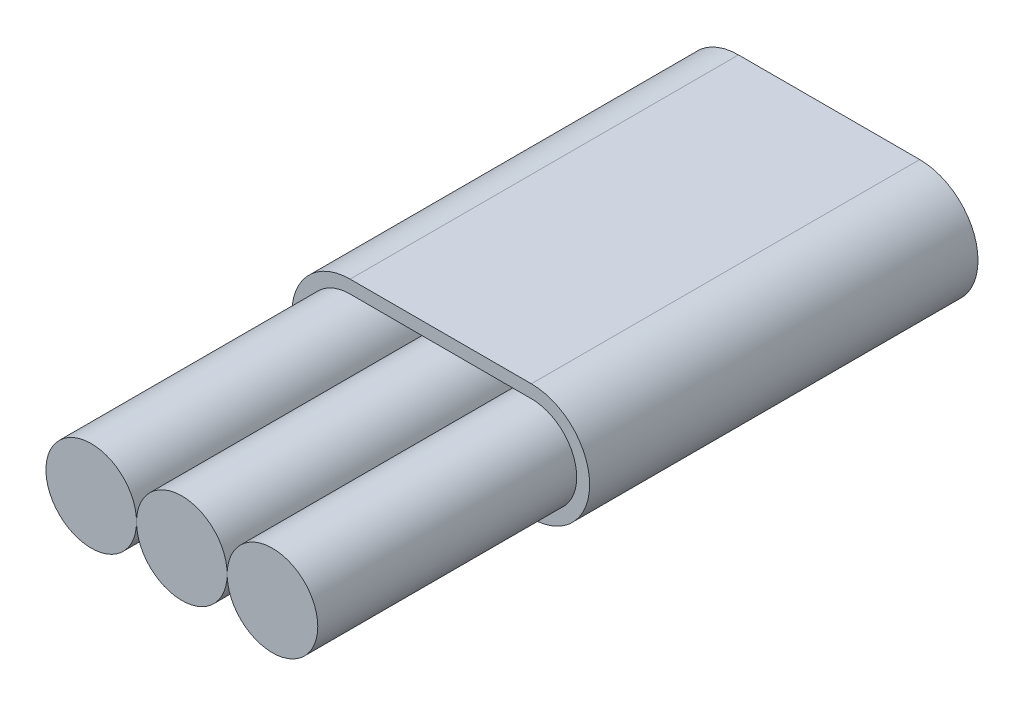
ISO-10303-21;
HEADER;
FILE_DESCRIPTION(('STEP AP214'),'2;1');
FILE_NAME('part.step','',(''),(''),'','','');
FILE_SCHEMA(('AUTOMOTIVE_DESIGN { 1 0 10303 214 1 1 1 1 }'));
ENDSEC;
DATA;
#1=APPLICATION_CONTEXT('core data for automotive mechanical design processes');
#2=APPLICATION_PROTOCOL_DEFINITION('international standard','automotive_design',2000,#1);
#3=PRODUCT_CONTEXT('',#1,'mechanical');
#4=PRODUCT('Part','Part','',(#3));
#5=PRODUCT_RELATED_PRODUCT_CATEGORY('part','',(#4));
#6=PRODUCT_DEFINITION_FORMATION('','',#4);
#7=PRODUCT_DEFINITION_CONTEXT('part definition',#1,'design');
#8=PRODUCT_DEFINITION('design','',#6,#7);
#9=PRODUCT_DEFINITION_SHAPE('','',#8);
#10=(LENGTH_UNIT() NAMED_UNIT(*) SI_UNIT(.MILLI.,.METRE.));
#11=(NAMED_UNIT(*) PLANE_ANGLE_UNIT() SI_UNIT($,.RADIAN.));
#12=(NAMED_UNIT(*) SI_UNIT($,.STERADIAN.) SOLID_ANGLE_UNIT());
#13=UNCERTAINTY_MEASURE_WITH_UNIT(LENGTH_MEASURE(1.E-05),#10,'distance_accuracy_value','');
#14=(GEOMETRIC_REPRESENTATION_CONTEXT(3) GLOBAL_UNCERTAINTY_ASSIGNED_CONTEXT((#13)) GLOBAL_UNIT_ASSIGNED_CONTEXT((#10,
#11,#12)) REPRESENTATION_CONTEXT('',''));
#15=CARTESIAN_POINT('',(0.,0.,0.));
#16=DIRECTION('',(0.,0.,1.));
#17=DIRECTION('',(1.,0.,0.));
#18=AXIS2_PLACEMENT_3D('',#15,#16,#17);
#19=CARTESIAN_POINT('',(-3.5,0.,15.));
#20=DIRECTION('',(0.,0.,1.));
#21=DIRECTION('',(1.,0.,0.));
#22=AXIS2_PLACEMENT_3D('',#19,#20,#21);
#23=PLANE('',#22);
#24=CARTESIAN_POINT('',(-3.5,0.,15.));
#25=DIRECTION('',(0.,0.,1.));
#26=DIRECTION('',(1.,0.,0.));
#27=AXIS2_PLACEMENT_3D('',#24,#25,#26);
#28=CIRCLE('',#27,2.25);
#29=CARTESIAN_POINT('',(-3.5,2.25,15.));
#30=VERTEX_POINT('',#29);
#31=CARTESIAN_POINT('',(-3.5,-2.25,15.));
#32=VERTEX_POINT('',#31);
#33=EDGE_CURVE('E181',#30,#32,#28,.T.);
#34=ORIENTED_EDGE('',*,*,#33,.T.);
#35=DIRECTION('',(1.,0.,0.));
#36=VECTOR('',#35,1.);
#37=CARTESIAN_POINT('',(-3.5,-2.25,15.));
#38=LINE('',#37,#36);
#39=CARTESIAN_POINT('',(3.5,-2.25,15.));
#40=VERTEX_POINT('',#39);
#41=EDGE_CURVE('E184',#32,#40,#38,.T.);
#42=ORIENTED_EDGE('',*,*,#41,.T.);
#43=CARTESIAN_POINT('',(3.5,0.,15.));
#44=DIRECTION('',(0.,0.,1.));
#45=DIRECTION('',(1.,0.,0.));
#46=AXIS2_PLACEMENT_3D('',#43,#44,#45);
#47=CIRCLE('',#46,2.25);
#48=CARTESIAN_POINT('',(3.5,2.25,15.));
#49=VERTEX_POINT('',#48);
#50=EDGE_CURVE('E187',#40,#49,#47,.T.);
#51=ORIENTED_EDGE('',*,*,#50,.T.);
#52=DIRECTION('',(-1.,0.,0.));
#53=VECTOR('',#52,1.);
#54=CARTESIAN_POINT('',(-3.5,2.25,15.));
#55=LINE('',#54,#53);
#56=EDGE_CURVE('E189',#49,#30,#55,.T.);
#57=ORIENTED_EDGE('',*,*,#56,.T.);
#58=EDGE_LOOP('',(#34,#42,#51,#57));
#59=FACE_BOUND('',#58,.T.);
#60=DIRECTION('',(1.,0.,0.));
#61=VECTOR('',#60,1.);
#62=CARTESIAN_POINT('',(-3.5,-1.75,15.));
#63=LINE('',#62,#61);
#64=CARTESIAN_POINT('',(-3.5,-1.75,15.));
#65=VERTEX_POINT('',#64);
#66=CARTESIAN_POINT('',(3.5,-1.75,15.));
#67=VERTEX_POINT('',#66);
#68=EDGE_CURVE('E153',#65,#67,#63,.T.);
#69=ORIENTED_EDGE('',*,*,#68,.F.);
#70=CARTESIAN_POINT('',(-3.5,0.,15.));
#71=DIRECTION('',(0.,0.,1.));
#72=DIRECTION('',(1.,0.,0.));
#73=AXIS2_PLACEMENT_3D('',#70,#71,#72);
#74=CIRCLE('',#73,1.75);
#75=CARTESIAN_POINT('',(-3.5,1.75,15.));
#76=VERTEX_POINT('',#75);
#77=EDGE_CURVE('E145',#76,#65,#74,.T.);
#78=ORIENTED_EDGE('',*,*,#77,.F.);
#79=DIRECTION('',(-1.,0.,0.));
#80=VECTOR('',#79,1.);
#81=CARTESIAN_POINT('',(-3.5,1.75,15.));
#82=LINE('',#81,#80);
#83=CARTESIAN_POINT('',(3.5,1.75,15.));
#84=VERTEX_POINT('',#83);
#85=EDGE_CURVE('E167',#84,#76,#82,.T.);
#86=ORIENTED_EDGE('',*,*,#85,.F.);
#87=CARTESIAN_POINT('',(3.5,0.,15.));
#88=DIRECTION('',(0.,0.,1.));
#89=DIRECTION('',(1.,0.,0.));
#90=AXIS2_PLACEMENT_3D('',#87,#88,#89);
#91=CIRCLE('',#90,1.75);
#92=EDGE_CURVE('E165',#67,#84,#91,.T.);
#93=ORIENTED_EDGE('',*,*,#92,.F.);
#94=EDGE_LOOP('',(#69,#78,#86,#93));
#95=FACE_BOUND('',#94,.T.);
#96=ADVANCED_FACE('F80',(#59,#95),#23,.T.);
#97=CARTESIAN_POINT('',(-3.5,0.,0.));
#98=DIRECTION('',(0.,0.,1.));
#99=DIRECTION('',(1.,0.,0.));
#100=AXIS2_PLACEMENT_3D('',#97,#98,#99);
#101=PLANE('',#100);
#102=CARTESIAN_POINT('',(-3.5,0.,0.));
#103=DIRECTION('',(0.,0.,1.));
#104=DIRECTION('',(1.,0.,0.));
#105=AXIS2_PLACEMENT_3D('',#102,#103,#104);
#106=CIRCLE('',#105,2.25);
#107=CARTESIAN_POINT('',(-3.5,2.25,0.));
#108=VERTEX_POINT('',#107);
#109=CARTESIAN_POINT('',(-3.5,-2.25,0.));
#110=VERTEX_POINT('',#109);
#111=EDGE_CURVE('E161',#108,#110,#106,.T.);
#112=ORIENTED_EDGE('',*,*,#111,.F.);
#113=DIRECTION('',(-1.,0.,0.));
#114=VECTOR('',#113,1.);
#115=CARTESIAN_POINT('',(-3.5,2.25,0.));
#116=LINE('',#115,#114);
#117=CARTESIAN_POINT('',(3.5,2.25,0.));
#118=VERTEX_POINT('',#117);
#119=EDGE_CURVE('E185',#118,#108,#116,.T.);
#120=ORIENTED_EDGE('',*,*,#119,.F.);
#121=CARTESIAN_POINT('',(3.5,0.,0.));
#122=DIRECTION('',(0.,0.,1.));
#123=DIRECTION('',(1.,0.,0.));
#124=AXIS2_PLACEMENT_3D('',#121,#122,#123);
#125=CIRCLE('',#124,2.25);
#126=CARTESIAN_POINT('',(3.5,-2.25,0.));
#127=VERTEX_POINT('',#126);
#128=EDGE_CURVE('E196',#127,#118,#125,.T.);
#129=ORIENTED_EDGE('',*,*,#128,.F.);
#130=DIRECTION('',(1.,0.,0.));
#131=VECTOR('',#130,1.);
#132=CARTESIAN_POINT('',(-3.5,-2.25,0.));
#133=LINE('',#132,#131);
#134=EDGE_CURVE('E194',#110,#127,#133,.T.);
#135=ORIENTED_EDGE('',*,*,#134,.F.);
#136=EDGE_LOOP('',(#112,#120,#129,#135));
#137=FACE_BOUND('',#136,.T.);
#138=CARTESIAN_POINT('',(-3.5,0.,0.));
#139=DIRECTION('',(0.,0.,1.));
#140=DIRECTION('',(1.,0.,0.));
#141=AXIS2_PLACEMENT_3D('',#138,#139,#140);
#142=CIRCLE('',#141,1.75);
#143=CARTESIAN_POINT('',(-3.5,1.75,0.));
#144=VERTEX_POINT('',#143);
#145=CARTESIAN_POINT('',(-3.5,-1.75,0.));
#146=VERTEX_POINT('',#145);
#147=EDGE_CURVE('E103',#144,#146,#142,.T.);
#148=ORIENTED_EDGE('',*,*,#147,.T.);
#149=DIRECTION('',(1.,0.,0.));
#150=VECTOR('',#149,1.);
#151=CARTESIAN_POINT('',(-3.5,-1.75,0.));
#152=LINE('',#151,#150);
#153=CARTESIAN_POINT('',(3.5,-1.75,0.));
#154=VERTEX_POINT('',#153);
#155=EDGE_CURVE('E160',#146,#154,#152,.T.);
#156=ORIENTED_EDGE('',*,*,#155,.T.);
#157=CARTESIAN_POINT('',(3.5,0.,0.));
#158=DIRECTION('',(0.,0.,1.));
#159=DIRECTION('',(1.,0.,0.));
#160=AXIS2_PLACEMENT_3D('',#157,#158,#159);
#161=CIRCLE('',#160,1.75);
#162=CARTESIAN_POINT('',(3.5,1.75,0.));
#163=VERTEX_POINT('',#162);
#164=EDGE_CURVE('E173',#154,#163,#161,.T.);
#165=ORIENTED_EDGE('',*,*,#164,.T.);
#166=DIRECTION('',(-1.,0.,0.));
#167=VECTOR('',#166,1.);
#168=CARTESIAN_POINT('',(-3.5,1.75,0.));
#169=LINE('',#168,#167);
#170=EDGE_CURVE('E154',#163,#144,#169,.T.);
#171=ORIENTED_EDGE('',*,*,#170,.T.);
#172=EDGE_LOOP('',(#148,#156,#165,#171));
#173=FACE_BOUND('',#172,.T.);
#174=ADVANCED_FACE('F214',(#137,#173),#101,.F.);
#175=CARTESIAN_POINT('',(-3.5,0.,15.));
#176=DIRECTION('',(0.,0.,-1.));
#177=DIRECTION('',(-1.,0.,0.));
#178=AXIS2_PLACEMENT_3D('',#175,#176,#177);
#179=CYLINDRICAL_SURFACE('',#178,2.25);
#180=ORIENTED_EDGE('',*,*,#111,.T.);
#181=DIRECTION('',(0.,0.,-1.));
#182=VECTOR('',#181,1.);
#183=CARTESIAN_POINT('',(-3.5,-2.25,15.));
#184=LINE('',#183,#182);
#185=EDGE_CURVE('E13',#32,#110,#184,.T.);
#186=ORIENTED_EDGE('',*,*,#185,.F.);
#187=ORIENTED_EDGE('',*,*,#33,.F.);
#188=DIRECTION('',(0.,0.,-1.));
#189=VECTOR('',#188,1.);
#190=CARTESIAN_POINT('',(-3.5,2.25,15.));
#191=LINE('',#190,#189);
#192=EDGE_CURVE('E191',#30,#108,#191,.T.);
#193=ORIENTED_EDGE('',*,*,#192,.T.);
#194=EDGE_LOOP('',(#180,#186,#187,#193));
#195=FACE_BOUND('',#194,.T.);
#196=ADVANCED_FACE('F82',(#195),#179,.T.);
#197=CARTESIAN_POINT('',(-3.5,-2.25,15.));
#198=DIRECTION('',(0.,1.,0.));
#199=DIRECTION('',(-1.,0.,0.));
#200=AXIS2_PLACEMENT_3D('',#197,#198,#199);
#201=PLANE('',#200);
#202=ORIENTED_EDGE('',*,*,#134,.T.);
#203=DIRECTION('',(0.,0.,-1.));
#204=VECTOR('',#203,1.);
#205=CARTESIAN_POINT('',(3.5,-2.25,15.));
#206=LINE('',#205,#204);
#207=EDGE_CURVE('E88',#40,#127,#206,.T.);
#208=ORIENTED_EDGE('',*,*,#207,.F.);
#209=ORIENTED_EDGE('',*,*,#41,.F.);
#210=ORIENTED_EDGE('',*,*,#185,.T.);
#211=EDGE_LOOP('',(#202,#208,#209,#210));
#212=FACE_BOUND('',#211,.T.);
#213=ADVANCED_FACE('F224',(#212),#201,.F.);
#214=CARTESIAN_POINT('',(3.5,0.,15.));
#215=DIRECTION('',(0.,0.,-1.));
#216=DIRECTION('',(-1.,0.,0.));
#217=AXIS2_PLACEMENT_3D('',#214,#215,#216);
#218=CYLINDRICAL_SURFACE('',#217,2.25);
#219=ORIENTED_EDGE('',*,*,#128,.T.);
#220=DIRECTION('',(0.,0.,-1.));
#221=VECTOR('',#220,1.);
#222=CARTESIAN_POINT('',(3.5,2.25,15.));
#223=LINE('',#222,#221);
#224=EDGE_CURVE('E201',#49,#118,#223,.T.);
#225=ORIENTED_EDGE('',*,*,#224,.F.);
#226=ORIENTED_EDGE('',*,*,#50,.F.);
#227=ORIENTED_EDGE('',*,*,#207,.T.);
#228=EDGE_LOOP('',(#219,#225,#226,#227));
#229=FACE_BOUND('',#228,.T.);
#230=ADVANCED_FACE('F208',(#229),#218,.T.);
#231=CARTESIAN_POINT('',(-3.5,2.25,15.));
#232=DIRECTION('',(0.,-1.,0.));
#233=DIRECTION('',(1.,0.,0.));
#234=AXIS2_PLACEMENT_3D('',#231,#232,#233);
#235=PLANE('',#234);
#236=ORIENTED_EDGE('',*,*,#119,.T.);
#237=ORIENTED_EDGE('',*,*,#192,.F.);
#238=ORIENTED_EDGE('',*,*,#56,.F.);
#239=ORIENTED_EDGE('',*,*,#224,.T.);
#240=EDGE_LOOP('',(#236,#237,#238,#239));
#241=FACE_BOUND('',#240,.T.);
#242=ADVANCED_FACE('F218',(#241),#235,.F.);
#243=CARTESIAN_POINT('',(-3.5,0.,15.));
#244=DIRECTION('',(0.,0.,-1.));
#245=DIRECTION('',(-1.,0.,0.));
#246=AXIS2_PLACEMENT_3D('',#243,#244,#245);
#247=CYLINDRICAL_SURFACE('',#246,1.75);
#248=ORIENTED_EDGE('',*,*,#147,.F.);
#249=DIRECTION('',(0.,0.,-1.));
#250=VECTOR('',#249,1.);
#251=CARTESIAN_POINT('',(-3.5,1.75,15.));
#252=LINE('',#251,#250);
#253=EDGE_CURVE('E149',#76,#144,#252,.T.);
#254=ORIENTED_EDGE('',*,*,#253,.F.);
#255=ORIENTED_EDGE('',*,*,#77,.T.);
#256=DIRECTION('',(0.,0.,-1.));
#257=VECTOR('',#256,1.);
#258=CARTESIAN_POINT('',(-3.5,-1.75,15.));
#259=LINE('',#258,#257);
#260=EDGE_CURVE('E148',#65,#146,#259,.T.);
#261=ORIENTED_EDGE('',*,*,#260,.T.);
#262=EDGE_LOOP('',(#248,#254,#255,#261));
#263=FACE_BOUND('',#262,.T.);
#264=ADVANCED_FACE('F147',(#263),#247,.F.);
#265=CARTESIAN_POINT('',(-3.5,-1.75,15.));
#266=DIRECTION('',(0.,1.,0.));
#267=DIRECTION('',(-1.,0.,0.));
#268=AXIS2_PLACEMENT_3D('',#265,#266,#267);
#269=PLANE('',#268);
#270=ORIENTED_EDGE('',*,*,#155,.F.);
#271=ORIENTED_EDGE('',*,*,#260,.F.);
#272=ORIENTED_EDGE('',*,*,#68,.T.);
#273=DIRECTION('',(0.,0.,-1.));
#274=VECTOR('',#273,1.);
#275=CARTESIAN_POINT('',(3.5,-1.75,15.));
#276=LINE('',#275,#274);
#277=EDGE_CURVE('E162',#67,#154,#276,.T.);
#278=ORIENTED_EDGE('',*,*,#277,.T.);
#279=EDGE_LOOP('',(#270,#271,#272,#278));
#280=FACE_BOUND('',#279,.T.);
#281=ADVANCED_FACE('F157',(#280),#269,.T.);
#282=CARTESIAN_POINT('',(3.5,0.,15.));
#283=DIRECTION('',(0.,0.,-1.));
#284=DIRECTION('',(-1.,0.,0.));
#285=AXIS2_PLACEMENT_3D('',#282,#283,#284);
#286=CYLINDRICAL_SURFACE('',#285,1.75);
#287=ORIENTED_EDGE('',*,*,#164,.F.);
#288=ORIENTED_EDGE('',*,*,#277,.F.);
#289=ORIENTED_EDGE('',*,*,#92,.T.);
#290=DIRECTION('',(0.,0.,-1.));
#291=VECTOR('',#290,1.);
#292=CARTESIAN_POINT('',(3.5,1.75,15.));
#293=LINE('',#292,#291);
#294=EDGE_CURVE('E95',#84,#163,#293,.T.);
#295=ORIENTED_EDGE('',*,*,#294,.T.);
#296=EDGE_LOOP('',(#287,#288,#289,#295));
#297=FACE_BOUND('',#296,.T.);
#298=ADVANCED_FACE('F247',(#297),#286,.F.);
#299=CARTESIAN_POINT('',(-3.5,1.75,15.));
#300=DIRECTION('',(0.,-1.,0.));
#301=DIRECTION('',(1.,0.,0.));
#302=AXIS2_PLACEMENT_3D('',#299,#300,#301);
#303=PLANE('',#302);
#304=ORIENTED_EDGE('',*,*,#170,.F.);
#305=ORIENTED_EDGE('',*,*,#294,.F.);
#306=ORIENTED_EDGE('',*,*,#85,.T.);
#307=ORIENTED_EDGE('',*,*,#253,.T.);
#308=EDGE_LOOP('',(#304,#305,#306,#307));
#309=FACE_BOUND('',#308,.T.);
#310=ADVANCED_FACE('F251',(#309),#303,.T.);
#311=CLOSED_SHELL('',(#96,#174,#196,#213,#230,#242,#264,#281,#298,#310));
#312=MANIFOLD_SOLID_BREP('B2',#311);
#313=CARTESIAN_POINT('',(-3.5,0.,25.));
#314=DIRECTION('',(0.,0.,-1.));
#315=DIRECTION('',(-1.,0.,0.));
#316=AXIS2_PLACEMENT_3D('',#313,#314,#315);
#317=CYLINDRICAL_SURFACE('',#316,1.75);
#318=CARTESIAN_POINT('',(-3.5,0.,25.));
#319=DIRECTION('',(0.,0.,1.));
#320=DIRECTION('',(1.,0.,0.));
#321=AXIS2_PLACEMENT_3D('',#318,#319,#320);
#322=CIRCLE('',#321,1.75);
#323=CARTESIAN_POINT('',(-1.75,0.,25.));
#324=VERTEX_POINT('',#323);
#325=EDGE_CURVE('E79',#324,#324,#322,.T.);
#326=ORIENTED_EDGE('',*,*,#325,.F.);
#327=EDGE_LOOP('',(#326));
#328=FACE_BOUND('',#327,.T.);
#329=CARTESIAN_POINT('',(-3.5,0.,0.));
#330=DIRECTION('',(0.,0.,1.));
#331=DIRECTION('',(1.,0.,0.));
#332=AXIS2_PLACEMENT_3D('',#329,#330,#331);
#333=CIRCLE('',#332,1.75);
#334=CARTESIAN_POINT('',(-1.75,0.,0.));
#335=VERTEX_POINT('',#334);
#336=EDGE_CURVE('E321',#335,#335,#333,.T.);
#337=ORIENTED_EDGE('',*,*,#336,.T.);
#338=EDGE_LOOP('',(#337));
#339=FACE_BOUND('',#338,.T.);
#340=ADVANCED_FACE('F318',(#328,#339),#317,.T.);
#341=CARTESIAN_POINT('',(0.,0.,25.));
#342=DIRECTION('',(0.,0.,1.));
#343=DIRECTION('',(1.,0.,0.));
#344=AXIS2_PLACEMENT_3D('',#341,#342,#343);
#345=PLANE('',#344);
#346=ORIENTED_EDGE('',*,*,#325,.T.);
#347=EDGE_LOOP('',(#346));
#348=FACE_BOUND('',#347,.T.);
#349=ADVANCED_FACE('F333',(#348),#345,.T.);
#350=CARTESIAN_POINT('',(0.,0.,0.));
#351=DIRECTION('',(0.,0.,1.));
#352=DIRECTION('',(1.,0.,0.));
#353=AXIS2_PLACEMENT_3D('',#350,#351,#352);
#354=PLANE('',#353);
#355=ORIENTED_EDGE('',*,*,#336,.F.);
#356=EDGE_LOOP('',(#355));
#357=FACE_BOUND('',#356,.T.);
#358=ADVANCED_FACE('F331',(#357),#354,.F.);
#359=CLOSED_SHELL('',(#340,#349,#358));
#360=MANIFOLD_SOLID_BREP('B7',#359);
#361=CARTESIAN_POINT('',(0.,0.,25.));
#362=DIRECTION('',(0.,0.,-1.));
#363=DIRECTION('',(-1.,0.,0.));
#364=AXIS2_PLACEMENT_3D('',#361,#362,#363);
#365=CYLINDRICAL_SURFACE('',#364,1.75);
#366=CARTESIAN_POINT('',(0.,0.,25.));
#367=DIRECTION('',(0.,0.,1.));
#368=DIRECTION('',(1.,0.,0.));
#369=AXIS2_PLACEMENT_3D('',#366,#367,#368);
#370=CIRCLE('',#369,1.75);
#371=CARTESIAN_POINT('',(1.75,0.,25.));
#372=VERTEX_POINT('',#371);
#373=EDGE_CURVE('E317',#372,#372,#370,.T.);
#374=ORIENTED_EDGE('',*,*,#373,.F.);
#375=EDGE_LOOP('',(#374));
#376=FACE_BOUND('',#375,.T.);
#377=CARTESIAN_POINT('',(0.,0.,0.));
#378=DIRECTION('',(0.,0.,1.));
#379=DIRECTION('',(1.,0.,0.));
#380=AXIS2_PLACEMENT_3D('',#377,#378,#379);
#381=CIRCLE('',#380,1.75);
#382=CARTESIAN_POINT('',(1.75,0.,0.));
#383=VERTEX_POINT('',#382);
#384=EDGE_CURVE('E369',#383,#383,#381,.T.);
#385=ORIENTED_EDGE('',*,*,#384,.T.);
#386=EDGE_LOOP('',(#385));
#387=FACE_BOUND('',#386,.T.);
#388=ADVANCED_FACE('F366',(#376,#387),#365,.T.);
#389=CARTESIAN_POINT('',(0.,0.,25.));
#390=DIRECTION('',(0.,0.,1.));
#391=DIRECTION('',(1.,0.,0.));
#392=AXIS2_PLACEMENT_3D('',#389,#390,#391);
#393=PLANE('',#392);
#394=ORIENTED_EDGE('',*,*,#373,.T.);
#395=EDGE_LOOP('',(#394));
#396=FACE_BOUND('',#395,.T.);
#397=ADVANCED_FACE('F381',(#396),#393,.T.);
#398=CARTESIAN_POINT('',(0.,0.,0.));
#399=DIRECTION('',(0.,0.,1.));
#400=DIRECTION('',(1.,0.,0.));
#401=AXIS2_PLACEMENT_3D('',#398,#399,#400);
#402=PLANE('',#401);
#403=ORIENTED_EDGE('',*,*,#384,.F.);
#404=EDGE_LOOP('',(#403));
#405=FACE_BOUND('',#404,.T.);
#406=ADVANCED_FACE('F379',(#405),#402,.F.);
#407=CLOSED_SHELL('',(#388,#397,#406));
#408=MANIFOLD_SOLID_BREP('B74',#407);
#409=CARTESIAN_POINT('',(3.5,0.,25.));
#410=DIRECTION('',(0.,0.,-1.));
#411=DIRECTION('',(-1.,0.,0.));
#412=AXIS2_PLACEMENT_3D('',#409,#410,#411);
#413=CYLINDRICAL_SURFACE('',#412,1.75);
#414=CARTESIAN_POINT('',(3.5,0.,25.));
#415=DIRECTION('',(0.,0.,1.));
#416=DIRECTION('',(1.,0.,0.));
#417=AXIS2_PLACEMENT_3D('',#414,#415,#416);
#418=CIRCLE('',#417,1.75);
#419=CARTESIAN_POINT('',(5.25,0.,25.));
#420=VERTEX_POINT('',#419);
#421=EDGE_CURVE('E365',#420,#420,#418,.T.);
#422=ORIENTED_EDGE('',*,*,#421,.F.);
#423=EDGE_LOOP('',(#422));
#424=FACE_BOUND('',#423,.T.);
#425=CARTESIAN_POINT('',(3.5,0.,0.));
#426=DIRECTION('',(0.,0.,1.));
#427=DIRECTION('',(1.,0.,0.));
#428=AXIS2_PLACEMENT_3D('',#425,#426,#427);
#429=CIRCLE('',#428,1.75);
#430=CARTESIAN_POINT('',(5.25,0.,0.));
#431=VERTEX_POINT('',#430);
#432=EDGE_CURVE('E410',#431,#431,#429,.T.);
#433=ORIENTED_EDGE('',*,*,#432,.T.);
#434=EDGE_LOOP('',(#433));
#435=FACE_BOUND('',#434,.T.);
#436=ADVANCED_FACE('F407',(#424,#435),#413,.T.);
#437=CARTESIAN_POINT('',(0.,0.,25.));
#438=DIRECTION('',(0.,0.,1.));
#439=DIRECTION('',(1.,0.,0.));
#440=AXIS2_PLACEMENT_3D('',#437,#438,#439);
#441=PLANE('',#440);
#442=ORIENTED_EDGE('',*,*,#421,.T.);
#443=EDGE_LOOP('',(#442));
#444=FACE_BOUND('',#443,.T.);
#445=ADVANCED_FACE('F422',(#444),#441,.T.);
#446=CARTESIAN_POINT('',(0.,0.,0.));
#447=DIRECTION('',(0.,0.,1.));
#448=DIRECTION('',(1.,0.,0.));
#449=AXIS2_PLACEMENT_3D('',#446,#447,#448);
#450=PLANE('',#449);
#451=ORIENTED_EDGE('',*,*,#432,.F.);
#452=EDGE_LOOP('',(#451));
#453=FACE_BOUND('',#452,.T.);
#454=ADVANCED_FACE('F420',(#453),#450,.F.);
#455=CLOSED_SHELL('',(#436,#445,#454));
#456=MANIFOLD_SOLID_BREP('B312',#455);
#457=ADVANCED_BREP_SHAPE_REPRESENTATION('',(#18,#312,#360,#408,#456),#14);
#458=SHAPE_DEFINITION_REPRESENTATION(#9,#457);
ENDSEC;
END-ISO-10303-21;
